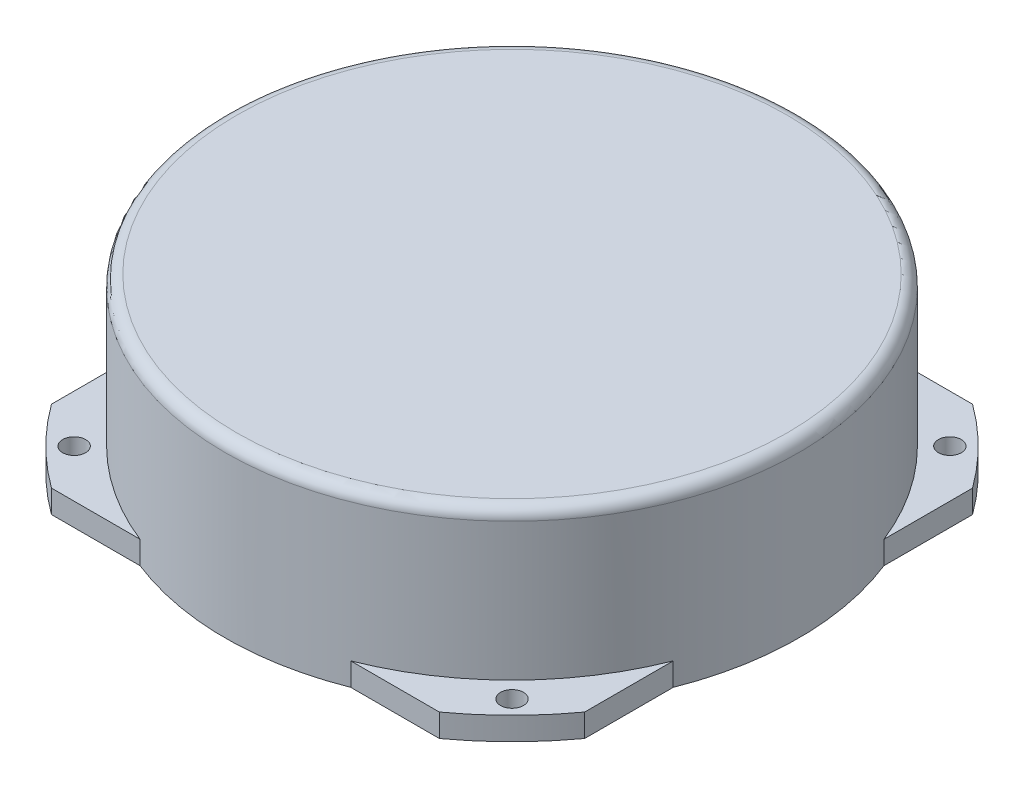
ISO-10303-21;
HEADER;
FILE_DESCRIPTION(('STEP AP214'),'2;1');
FILE_NAME('part.step','',(''),(''),'','','');
FILE_SCHEMA(('AUTOMOTIVE_DESIGN { 1 0 10303 214 1 1 1 1 }'));
ENDSEC;
DATA;
#1=APPLICATION_CONTEXT('core data for automotive mechanical design processes');
#2=APPLICATION_PROTOCOL_DEFINITION('international standard','automotive_design',2000,#1);
#3=PRODUCT_CONTEXT('',#1,'mechanical');
#4=PRODUCT('Part','Part','',(#3));
#5=PRODUCT_RELATED_PRODUCT_CATEGORY('part','',(#4));
#6=PRODUCT_DEFINITION_FORMATION('','',#4);
#7=PRODUCT_DEFINITION_CONTEXT('part definition',#1,'design');
#8=PRODUCT_DEFINITION('design','',#6,#7);
#9=PRODUCT_DEFINITION_SHAPE('','',#8);
#10=(LENGTH_UNIT() NAMED_UNIT(*) SI_UNIT(.MILLI.,.METRE.));
#11=(NAMED_UNIT(*) PLANE_ANGLE_UNIT() SI_UNIT($,.RADIAN.));
#12=(NAMED_UNIT(*) SI_UNIT($,.STERADIAN.) SOLID_ANGLE_UNIT());
#13=UNCERTAINTY_MEASURE_WITH_UNIT(LENGTH_MEASURE(1.E-05),#10,'distance_accuracy_value','');
#14=(GEOMETRIC_REPRESENTATION_CONTEXT(3) GLOBAL_UNCERTAINTY_ASSIGNED_CONTEXT((#13)) GLOBAL_UNIT_ASSIGNED_CONTEXT((#10,
#11,#12)) REPRESENTATION_CONTEXT('',''));
#15=CARTESIAN_POINT('',(0.,0.,0.));
#16=DIRECTION('',(0.,0.,1.));
#17=DIRECTION('',(1.,0.,0.));
#18=AXIS2_PLACEMENT_3D('',#15,#16,#17);
#19=CARTESIAN_POINT('',(0.,30.,0.));
#20=DIRECTION('',(0.,-1.,0.));
#21=DIRECTION('',(0.,0.,-1.));
#22=AXIS2_PLACEMENT_3D('',#19,#20,#21);
#23=CYLINDRICAL_SURFACE('',#22,50.);
#24=CARTESIAN_POINT('',(0.,28.,0.));
#25=DIRECTION('',(0.,1.,0.));
#26=DIRECTION('',(0.,0.,1.));
#27=AXIS2_PLACEMENT_3D('',#24,#25,#26);
#28=CIRCLE('',#27,50.);
#29=CARTESIAN_POINT('',(0.,28.,50.));
#30=VERTEX_POINT('',#29);
#31=EDGE_CURVE('E11',#30,#30,#28,.F.);
#32=ORIENTED_EDGE('',*,*,#31,.T.);
#33=EDGE_LOOP('',(#32));
#34=FACE_BOUND('',#33,.T.);
#35=CARTESIAN_POINT('',(0.,0.,0.));
#36=DIRECTION('',(0.,1.,0.));
#37=DIRECTION('',(0.,0.,1.));
#38=AXIS2_PLACEMENT_3D('',#35,#36,#37);
#39=CIRCLE('',#38,50.);
#40=CARTESIAN_POINT('',(46.5,0.,18.3779759494891));
#41=VERTEX_POINT('',#40);
#42=CARTESIAN_POINT('',(46.5,0.,-18.3779759494891));
#43=VERTEX_POINT('',#42);
#44=EDGE_CURVE('E399',#41,#43,#39,.T.);
#45=ORIENTED_EDGE('',*,*,#44,.T.);
#46=DIRECTION('',(0.,-1.,0.));
#47=VECTOR('',#46,1.);
#48=CARTESIAN_POINT('',(46.5,4.,-18.3779759494891));
#49=LINE('',#48,#47);
#50=CARTESIAN_POINT('',(46.5,4.,-18.3779759494891));
#51=VERTEX_POINT('',#50);
#52=EDGE_CURVE('E57',#51,#43,#49,.T.);
#53=ORIENTED_EDGE('',*,*,#52,.F.);
#54=CARTESIAN_POINT('',(0.,4.,0.));
#55=DIRECTION('',(0.,1.,0.));
#56=DIRECTION('',(0.,0.,1.));
#57=AXIS2_PLACEMENT_3D('',#54,#55,#56);
#58=CIRCLE('',#57,50.);
#59=CARTESIAN_POINT('',(18.3779759494892,4.,-46.5));
#60=VERTEX_POINT('',#59);
#61=EDGE_CURVE('E52',#51,#60,#58,.T.);
#62=ORIENTED_EDGE('',*,*,#61,.T.);
#63=DIRECTION('',(0.,-1.,0.));
#64=VECTOR('',#63,1.);
#65=CARTESIAN_POINT('',(18.3779759494891,4.,-46.5));
#66=LINE('',#65,#64);
#67=CARTESIAN_POINT('',(18.3779759494891,0.,-46.5));
#68=VERTEX_POINT('',#67);
#69=EDGE_CURVE('E188',#60,#68,#66,.T.);
#70=ORIENTED_EDGE('',*,*,#69,.T.);
#71=CARTESIAN_POINT('',(-18.3779759494892,0.,-46.5));
#72=VERTEX_POINT('',#71);
#73=EDGE_CURVE('E295',#68,#72,#39,.T.);
#74=ORIENTED_EDGE('',*,*,#73,.T.);
#75=DIRECTION('',(0.,-1.,0.));
#76=VECTOR('',#75,1.);
#77=CARTESIAN_POINT('',(-18.3779759494891,4.,-46.5));
#78=LINE('',#77,#76);
#79=CARTESIAN_POINT('',(-18.3779759494892,4.,-46.5));
#80=VERTEX_POINT('',#79);
#81=EDGE_CURVE('E275',#80,#72,#78,.T.);
#82=ORIENTED_EDGE('',*,*,#81,.F.);
#83=CARTESIAN_POINT('',(0.,4.,0.));
#84=DIRECTION('',(0.,1.,0.));
#85=DIRECTION('',(0.,0.,1.));
#86=AXIS2_PLACEMENT_3D('',#83,#84,#85);
#87=CIRCLE('',#86,50.);
#88=CARTESIAN_POINT('',(-46.5,4.,-18.3779759494891));
#89=VERTEX_POINT('',#88);
#90=EDGE_CURVE('E273',#80,#89,#87,.T.);
#91=ORIENTED_EDGE('',*,*,#90,.T.);
#92=DIRECTION('',(0.,-1.,0.));
#93=VECTOR('',#92,1.);
#94=CARTESIAN_POINT('',(-46.5,4.,-18.3779759494891));
#95=LINE('',#94,#93);
#96=CARTESIAN_POINT('',(-46.5,0.,-18.3779759494891));
#97=VERTEX_POINT('',#96);
#98=EDGE_CURVE('E288',#89,#97,#95,.T.);
#99=ORIENTED_EDGE('',*,*,#98,.T.);
#100=CARTESIAN_POINT('',(-46.5,0.,18.3779759494892));
#101=VERTEX_POINT('',#100);
#102=EDGE_CURVE('E296',#97,#101,#39,.T.);
#103=ORIENTED_EDGE('',*,*,#102,.T.);
#104=DIRECTION('',(0.,-1.,0.));
#105=VECTOR('',#104,1.);
#106=CARTESIAN_POINT('',(-46.5,4.,18.3779759494892));
#107=LINE('',#106,#105);
#108=CARTESIAN_POINT('',(-46.5,4.,18.3779759494892));
#109=VERTEX_POINT('',#108);
#110=EDGE_CURVE('E240',#109,#101,#107,.T.);
#111=ORIENTED_EDGE('',*,*,#110,.F.);
#112=CARTESIAN_POINT('',(0.,4.,0.));
#113=DIRECTION('',(0.,1.,0.));
#114=DIRECTION('',(0.,0.,1.));
#115=AXIS2_PLACEMENT_3D('',#112,#113,#114);
#116=CIRCLE('',#115,50.);
#117=CARTESIAN_POINT('',(-18.3779759494891,4.,46.5));
#118=VERTEX_POINT('',#117);
#119=EDGE_CURVE('E238',#109,#118,#116,.T.);
#120=ORIENTED_EDGE('',*,*,#119,.T.);
#121=DIRECTION('',(0.,-1.,0.));
#122=VECTOR('',#121,1.);
#123=CARTESIAN_POINT('',(-18.3779759494891,4.,46.5));
#124=LINE('',#123,#122);
#125=CARTESIAN_POINT('',(-18.3779759494891,0.,46.5));
#126=VERTEX_POINT('',#125);
#127=EDGE_CURVE('E253',#118,#126,#124,.T.);
#128=ORIENTED_EDGE('',*,*,#127,.T.);
#129=CARTESIAN_POINT('',(18.3779759494891,0.,46.5));
#130=VERTEX_POINT('',#129);
#131=EDGE_CURVE('E297',#126,#130,#39,.T.);
#132=ORIENTED_EDGE('',*,*,#131,.T.);
#133=DIRECTION('',(0.,-1.,0.));
#134=VECTOR('',#133,1.);
#135=CARTESIAN_POINT('',(18.3779759494891,4.,46.5));
#136=LINE('',#135,#134);
#137=CARTESIAN_POINT('',(18.3779759494891,4.,46.5));
#138=VERTEX_POINT('',#137);
#139=EDGE_CURVE('E205',#138,#130,#136,.T.);
#140=ORIENTED_EDGE('',*,*,#139,.F.);
#141=CARTESIAN_POINT('',(0.,4.,0.));
#142=DIRECTION('',(0.,1.,0.));
#143=DIRECTION('',(0.,0.,1.));
#144=AXIS2_PLACEMENT_3D('',#141,#142,#143);
#145=CIRCLE('',#144,50.);
#146=CARTESIAN_POINT('',(46.5,4.,18.3779759494891));
#147=VERTEX_POINT('',#146);
#148=EDGE_CURVE('E203',#138,#147,#145,.T.);
#149=ORIENTED_EDGE('',*,*,#148,.T.);
#150=DIRECTION('',(0.,-1.,0.));
#151=VECTOR('',#150,1.);
#152=CARTESIAN_POINT('',(46.5,4.,18.3779759494891));
#153=LINE('',#152,#151);
#154=EDGE_CURVE('E218',#147,#41,#153,.T.);
#155=ORIENTED_EDGE('',*,*,#154,.T.);
#156=EDGE_LOOP('',(#45,#53,#62,#70,#74,#82,#91,#99,#103,#111,#120,#128,#132,#140,#149,#155));
#157=FACE_BOUND('',#156,.T.);
#158=ADVANCED_FACE('F37',(#34,#157),#23,.T.);
#159=CARTESIAN_POINT('',(0.,30.,0.));
#160=DIRECTION('',(0.,1.,0.));
#161=DIRECTION('',(0.,0.,1.));
#162=AXIS2_PLACEMENT_3D('',#159,#160,#161);
#163=PLANE('',#162);
#164=CARTESIAN_POINT('',(0.,30.,0.));
#165=DIRECTION('',(0.,1.,0.));
#166=DIRECTION('',(0.,0.,1.));
#167=AXIS2_PLACEMENT_3D('',#164,#165,#166);
#168=CIRCLE('',#167,48.);
#169=CARTESIAN_POINT('',(0.,30.,48.));
#170=VERTEX_POINT('',#169);
#171=EDGE_CURVE('E45',#170,#170,#168,.T.);
#172=ORIENTED_EDGE('',*,*,#171,.T.);
#173=EDGE_LOOP('',(#172));
#174=FACE_BOUND('',#173,.T.);
#175=ADVANCED_FACE('F301',(#174),#163,.T.);
#176=CARTESIAN_POINT('',(0.,0.,0.));
#177=DIRECTION('',(0.,1.,0.));
#178=DIRECTION('',(0.,0.,1.));
#179=AXIS2_PLACEMENT_3D('',#176,#177,#178);
#180=PLANE('',#179);
#181=ORIENTED_EDGE('',*,*,#102,.F.);
#182=DIRECTION('',(0.,0.,-1.));
#183=VECTOR('',#182,1.);
#184=CARTESIAN_POINT('',(-46.5,0.,0.));
#185=LINE('',#184,#183);
#186=CARTESIAN_POINT('',(-46.5,0.,-33.8230690505755));
#187=VERTEX_POINT('',#186);
#188=EDGE_CURVE('E265',#97,#187,#185,.T.);
#189=ORIENTED_EDGE('',*,*,#188,.T.);
#190=CARTESIAN_POINT('',(0.,0.,0.));
#191=DIRECTION('',(0.,1.,0.));
#192=DIRECTION('',(0.,0.,1.));
#193=AXIS2_PLACEMENT_3D('',#190,#191,#192);
#194=CIRCLE('',#193,57.5);
#195=CARTESIAN_POINT('',(-33.8230690505755,0.,-46.5));
#196=VERTEX_POINT('',#195);
#197=EDGE_CURVE('E281',#196,#187,#194,.T.);
#198=ORIENTED_EDGE('',*,*,#197,.F.);
#199=DIRECTION('',(1.,0.,0.));
#200=VECTOR('',#199,1.);
#201=CARTESIAN_POINT('',(0.,0.,-46.5));
#202=LINE('',#201,#200);
#203=EDGE_CURVE('E278',#196,#72,#202,.T.);
#204=ORIENTED_EDGE('',*,*,#203,.T.);
#205=ORIENTED_EDGE('',*,*,#73,.F.);
#206=DIRECTION('',(1.,0.,0.));
#207=VECTOR('',#206,1.);
#208=CARTESIAN_POINT('',(0.,0.,-46.5));
#209=LINE('',#208,#207);
#210=CARTESIAN_POINT('',(33.8230690505755,0.,-46.5));
#211=VERTEX_POINT('',#210);
#212=EDGE_CURVE('E174',#68,#211,#209,.T.);
#213=ORIENTED_EDGE('',*,*,#212,.T.);
#214=CARTESIAN_POINT('',(0.,0.,0.));
#215=DIRECTION('',(0.,1.,0.));
#216=DIRECTION('',(0.,0.,1.));
#217=AXIS2_PLACEMENT_3D('',#214,#215,#216);
#218=CIRCLE('',#217,57.5);
#219=CARTESIAN_POINT('',(46.5,0.,-33.8230690505755));
#220=VERTEX_POINT('',#219);
#221=EDGE_CURVE('E183',#220,#211,#218,.T.);
#222=ORIENTED_EDGE('',*,*,#221,.F.);
#223=DIRECTION('',(0.,0.,1.));
#224=VECTOR('',#223,1.);
#225=CARTESIAN_POINT('',(46.5,0.,0.));
#226=LINE('',#225,#224);
#227=EDGE_CURVE('E155',#220,#43,#226,.T.);
#228=ORIENTED_EDGE('',*,*,#227,.T.);
#229=ORIENTED_EDGE('',*,*,#44,.F.);
#230=DIRECTION('',(0.,0.,1.));
#231=VECTOR('',#230,1.);
#232=CARTESIAN_POINT('',(46.5,0.,0.));
#233=LINE('',#232,#231);
#234=CARTESIAN_POINT('',(46.5,0.,33.8230690505755));
#235=VERTEX_POINT('',#234);
#236=EDGE_CURVE('E195',#41,#235,#233,.T.);
#237=ORIENTED_EDGE('',*,*,#236,.T.);
#238=CARTESIAN_POINT('',(0.,0.,0.));
#239=DIRECTION('',(0.,1.,0.));
#240=DIRECTION('',(0.,0.,1.));
#241=AXIS2_PLACEMENT_3D('',#238,#239,#240);
#242=CIRCLE('',#241,57.5);
#243=CARTESIAN_POINT('',(33.8230690505755,0.,46.5));
#244=VERTEX_POINT('',#243);
#245=EDGE_CURVE('E211',#244,#235,#242,.T.);
#246=ORIENTED_EDGE('',*,*,#245,.F.);
#247=DIRECTION('',(-1.,0.,0.));
#248=VECTOR('',#247,1.);
#249=CARTESIAN_POINT('',(0.,0.,46.5));
#250=LINE('',#249,#248);
#251=EDGE_CURVE('E208',#244,#130,#250,.T.);
#252=ORIENTED_EDGE('',*,*,#251,.T.);
#253=ORIENTED_EDGE('',*,*,#131,.F.);
#254=DIRECTION('',(-1.,0.,0.));
#255=VECTOR('',#254,1.);
#256=CARTESIAN_POINT('',(0.,0.,46.5));
#257=LINE('',#256,#255);
#258=CARTESIAN_POINT('',(-33.8230690505755,0.,46.5));
#259=VERTEX_POINT('',#258);
#260=EDGE_CURVE('E230',#126,#259,#257,.T.);
#261=ORIENTED_EDGE('',*,*,#260,.T.);
#262=CARTESIAN_POINT('',(0.,0.,0.));
#263=DIRECTION('',(0.,1.,0.));
#264=DIRECTION('',(0.,0.,1.));
#265=AXIS2_PLACEMENT_3D('',#262,#263,#264);
#266=CIRCLE('',#265,57.5);
#267=CARTESIAN_POINT('',(-46.5,0.,33.8230690505755));
#268=VERTEX_POINT('',#267);
#269=EDGE_CURVE('E246',#268,#259,#266,.T.);
#270=ORIENTED_EDGE('',*,*,#269,.F.);
#271=DIRECTION('',(0.,0.,-1.));
#272=VECTOR('',#271,1.);
#273=CARTESIAN_POINT('',(-46.5,0.,0.));
#274=LINE('',#273,#272);
#275=EDGE_CURVE('E243',#268,#101,#274,.T.);
#276=ORIENTED_EDGE('',*,*,#275,.T.);
#277=EDGE_LOOP('',(#181,#189,#198,#204,#205,#213,#222,#228,#229,#237,#246,#252,#253,#261,#270,#276));
#278=FACE_BOUND('',#277,.T.);
#279=CARTESIAN_POINT('',(-38.1837661840637,0.,-38.1837661840834));
#280=DIRECTION('',(0.,1.,0.));
#281=DIRECTION('',(0.,0.,1.));
#282=AXIS2_PLACEMENT_3D('',#279,#280,#281);
#283=CIRCLE('',#282,2.);
#284=CARTESIAN_POINT('',(-38.1837661840637,0.,-36.1837661840834));
#285=VERTEX_POINT('',#284);
#286=EDGE_CURVE('E260',#285,#285,#283,.T.);
#287=ORIENTED_EDGE('',*,*,#286,.T.);
#288=EDGE_LOOP('',(#287));
#289=FACE_BOUND('',#288,.T.);
#290=CARTESIAN_POINT('',(-38.1837661840791,0.,38.1837661840637));
#291=DIRECTION('',(0.,1.,0.));
#292=DIRECTION('',(0.,0.,1.));
#293=AXIS2_PLACEMENT_3D('',#290,#291,#292);
#294=CIRCLE('',#293,2.00000000000178);
#295=CARTESIAN_POINT('',(-38.1837661840791,0.,40.1837661840655));
#296=VERTEX_POINT('',#295);
#297=EDGE_CURVE('E225',#296,#296,#294,.T.);
#298=ORIENTED_EDGE('',*,*,#297,.T.);
#299=EDGE_LOOP('',(#298));
#300=FACE_BOUND('',#299,.T.);
#301=CARTESIAN_POINT('',(38.183766184068,0.,38.1837661840791));
#302=DIRECTION('',(0.,1.,0.));
#303=DIRECTION('',(0.,0.,1.));
#304=AXIS2_PLACEMENT_3D('',#301,#302,#303);
#305=CIRCLE('',#304,2.0000000000057);
#306=CARTESIAN_POINT('',(38.183766184068,0.,40.1837661840848));
#307=VERTEX_POINT('',#306);
#308=EDGE_CURVE('E159',#307,#307,#305,.T.);
#309=ORIENTED_EDGE('',*,*,#308,.T.);
#310=EDGE_LOOP('',(#309));
#311=FACE_BOUND('',#310,.T.);
#312=CARTESIAN_POINT('',(38.1837661840834,0.,-38.183766184068));
#313=DIRECTION('',(0.,1.,0.));
#314=DIRECTION('',(0.,0.,1.));
#315=AXIS2_PLACEMENT_3D('',#312,#313,#314);
#316=CIRCLE('',#315,2.00000000000427);
#317=CARTESIAN_POINT('',(38.1837661840834,0.,-36.1837661840637));
#318=VERTEX_POINT('',#317);
#319=EDGE_CURVE('E179',#318,#318,#316,.T.);
#320=ORIENTED_EDGE('',*,*,#319,.T.);
#321=EDGE_LOOP('',(#320));
#322=FACE_BOUND('',#321,.T.);
#323=ADVANCED_FACE('F317',(#278,#289,#300,#311,#322),#180,.F.);
#324=CARTESIAN_POINT('',(0.,4.,-46.5));
#325=DIRECTION('',(0.,0.,-1.));
#326=DIRECTION('',(-1.,0.,0.));
#327=AXIS2_PLACEMENT_3D('',#324,#325,#326);
#328=PLANE('',#327);
#329=ORIENTED_EDGE('',*,*,#203,.F.);
#330=DIRECTION('',(0.,-1.,0.));
#331=VECTOR('',#330,1.);
#332=CARTESIAN_POINT('',(-33.8230690505755,4.,-46.5));
#333=LINE('',#332,#331);
#334=CARTESIAN_POINT('',(-33.8230690505755,4.,-46.5));
#335=VERTEX_POINT('',#334);
#336=EDGE_CURVE('E293',#335,#196,#333,.T.);
#337=ORIENTED_EDGE('',*,*,#336,.F.);
#338=DIRECTION('',(1.,0.,0.));
#339=VECTOR('',#338,1.);
#340=CARTESIAN_POINT('',(0.,4.,-46.5));
#341=LINE('',#340,#339);
#342=EDGE_CURVE('E264',#335,#80,#341,.T.);
#343=ORIENTED_EDGE('',*,*,#342,.T.);
#344=ORIENTED_EDGE('',*,*,#81,.T.);
#345=EDGE_LOOP('',(#329,#337,#343,#344));
#346=FACE_BOUND('',#345,.T.);
#347=ADVANCED_FACE('F321',(#346),#328,.T.);
#348=CARTESIAN_POINT('',(0.,4.,0.));
#349=DIRECTION('',(0.,-1.,0.));
#350=DIRECTION('',(0.,0.,-1.));
#351=AXIS2_PLACEMENT_3D('',#348,#349,#350);
#352=CYLINDRICAL_SURFACE('',#351,57.5);
#353=ORIENTED_EDGE('',*,*,#197,.T.);
#354=DIRECTION('',(0.,-1.,0.));
#355=VECTOR('',#354,1.);
#356=CARTESIAN_POINT('',(-46.5,4.,-33.8230690505755));
#357=LINE('',#356,#355);
#358=CARTESIAN_POINT('',(-46.5,4.,-33.8230690505755));
#359=VERTEX_POINT('',#358);
#360=EDGE_CURVE('E291',#359,#187,#357,.T.);
#361=ORIENTED_EDGE('',*,*,#360,.F.);
#362=CARTESIAN_POINT('',(0.,4.,0.));
#363=DIRECTION('',(0.,1.,0.));
#364=DIRECTION('',(0.,0.,1.));
#365=AXIS2_PLACEMENT_3D('',#362,#363,#364);
#366=CIRCLE('',#365,57.5);
#367=EDGE_CURVE('E268',#335,#359,#366,.T.);
#368=ORIENTED_EDGE('',*,*,#367,.F.);
#369=ORIENTED_EDGE('',*,*,#336,.T.);
#370=EDGE_LOOP('',(#353,#361,#368,#369));
#371=FACE_BOUND('',#370,.T.);
#372=ADVANCED_FACE('F332',(#371),#352,.T.);
#373=CARTESIAN_POINT('',(-46.5,4.,0.));
#374=DIRECTION('',(-1.,0.,0.));
#375=DIRECTION('',(0.,0.,1.));
#376=AXIS2_PLACEMENT_3D('',#373,#374,#375);
#377=PLANE('',#376);
#378=ORIENTED_EDGE('',*,*,#188,.F.);
#379=ORIENTED_EDGE('',*,*,#98,.F.);
#380=DIRECTION('',(0.,0.,-1.));
#381=VECTOR('',#380,1.);
#382=CARTESIAN_POINT('',(-46.5,4.,0.));
#383=LINE('',#382,#381);
#384=EDGE_CURVE('E270',#89,#359,#383,.T.);
#385=ORIENTED_EDGE('',*,*,#384,.T.);
#386=ORIENTED_EDGE('',*,*,#360,.T.);
#387=EDGE_LOOP('',(#378,#379,#385,#386));
#388=FACE_BOUND('',#387,.T.);
#389=ADVANCED_FACE('F328',(#388),#377,.T.);
#390=CARTESIAN_POINT('',(-38.1837661840637,4.,-38.1837661840834));
#391=DIRECTION('',(0.,-1.,0.));
#392=DIRECTION('',(0.,0.,-1.));
#393=AXIS2_PLACEMENT_3D('',#390,#391,#392);
#394=CYLINDRICAL_SURFACE('',#393,2.);
#395=CARTESIAN_POINT('',(-38.1837661840637,4.,-38.1837661840834));
#396=DIRECTION('',(0.,1.,0.));
#397=DIRECTION('',(0.,0.,1.));
#398=AXIS2_PLACEMENT_3D('',#395,#396,#397);
#399=CIRCLE('',#398,2.);
#400=CARTESIAN_POINT('',(-38.1837661840637,4.,-36.1837661840834));
#401=VERTEX_POINT('',#400);
#402=EDGE_CURVE('E261',#401,#401,#399,.T.);
#403=ORIENTED_EDGE('',*,*,#402,.T.);
#404=EDGE_LOOP('',(#403));
#405=FACE_BOUND('',#404,.T.);
#406=ORIENTED_EDGE('',*,*,#286,.F.);
#407=EDGE_LOOP('',(#406));
#408=FACE_BOUND('',#407,.T.);
#409=ADVANCED_FACE('F324',(#405,#408),#394,.F.);
#410=CARTESIAN_POINT('',(0.,4.,0.));
#411=DIRECTION('',(0.,1.,0.));
#412=DIRECTION('',(0.,0.,1.));
#413=AXIS2_PLACEMENT_3D('',#410,#411,#412);
#414=PLANE('',#413);
#415=ORIENTED_EDGE('',*,*,#402,.F.);
#416=EDGE_LOOP('',(#415));
#417=FACE_BOUND('',#416,.T.);
#418=ORIENTED_EDGE('',*,*,#342,.F.);
#419=ORIENTED_EDGE('',*,*,#367,.T.);
#420=ORIENTED_EDGE('',*,*,#384,.F.);
#421=ORIENTED_EDGE('',*,*,#90,.F.);
#422=EDGE_LOOP('',(#418,#419,#420,#421));
#423=FACE_BOUND('',#422,.T.);
#424=ADVANCED_FACE('F327',(#417,#423),#414,.T.);
#425=CARTESIAN_POINT('',(-46.5,4.,0.));
#426=DIRECTION('',(-1.,0.,0.));
#427=DIRECTION('',(0.,0.,1.));
#428=AXIS2_PLACEMENT_3D('',#425,#426,#427);
#429=PLANE('',#428);
#430=ORIENTED_EDGE('',*,*,#275,.F.);
#431=DIRECTION('',(0.,-1.,0.));
#432=VECTOR('',#431,1.);
#433=CARTESIAN_POINT('',(-46.5,4.,33.8230690505755));
#434=LINE('',#433,#432);
#435=CARTESIAN_POINT('',(-46.5,4.,33.8230690505755));
#436=VERTEX_POINT('',#435);
#437=EDGE_CURVE('E258',#436,#268,#434,.T.);
#438=ORIENTED_EDGE('',*,*,#437,.F.);
#439=DIRECTION('',(0.,0.,-1.));
#440=VECTOR('',#439,1.);
#441=CARTESIAN_POINT('',(-46.5,4.,0.));
#442=LINE('',#441,#440);
#443=EDGE_CURVE('E229',#436,#109,#442,.T.);
#444=ORIENTED_EDGE('',*,*,#443,.T.);
#445=ORIENTED_EDGE('',*,*,#110,.T.);
#446=EDGE_LOOP('',(#430,#438,#444,#445));
#447=FACE_BOUND('',#446,.T.);
#448=ADVANCED_FACE('F342',(#447),#429,.T.);
#449=CARTESIAN_POINT('',(0.,4.,0.));
#450=DIRECTION('',(0.,-1.,0.));
#451=DIRECTION('',(0.,0.,-1.));
#452=AXIS2_PLACEMENT_3D('',#449,#450,#451);
#453=CYLINDRICAL_SURFACE('',#452,57.5);
#454=ORIENTED_EDGE('',*,*,#269,.T.);
#455=DIRECTION('',(0.,-1.,0.));
#456=VECTOR('',#455,1.);
#457=CARTESIAN_POINT('',(-33.8230690505755,4.,46.5));
#458=LINE('',#457,#456);
#459=CARTESIAN_POINT('',(-33.8230690505755,4.,46.5));
#460=VERTEX_POINT('',#459);
#461=EDGE_CURVE('E256',#460,#259,#458,.T.);
#462=ORIENTED_EDGE('',*,*,#461,.F.);
#463=CARTESIAN_POINT('',(0.,4.,0.));
#464=DIRECTION('',(0.,1.,0.));
#465=DIRECTION('',(0.,0.,1.));
#466=AXIS2_PLACEMENT_3D('',#463,#464,#465);
#467=CIRCLE('',#466,57.5);
#468=EDGE_CURVE('E233',#436,#460,#467,.T.);
#469=ORIENTED_EDGE('',*,*,#468,.F.);
#470=ORIENTED_EDGE('',*,*,#437,.T.);
#471=EDGE_LOOP('',(#454,#462,#469,#470));
#472=FACE_BOUND('',#471,.T.);
#473=ADVANCED_FACE('F352',(#472),#453,.T.);
#474=CARTESIAN_POINT('',(0.,4.,46.5));
#475=DIRECTION('',(0.,0.,1.));
#476=DIRECTION('',(1.,0.,0.));
#477=AXIS2_PLACEMENT_3D('',#474,#475,#476);
#478=PLANE('',#477);
#479=ORIENTED_EDGE('',*,*,#260,.F.);
#480=ORIENTED_EDGE('',*,*,#127,.F.);
#481=DIRECTION('',(-1.,0.,0.));
#482=VECTOR('',#481,1.);
#483=CARTESIAN_POINT('',(0.,4.,46.5));
#484=LINE('',#483,#482);
#485=EDGE_CURVE('E235',#118,#460,#484,.T.);
#486=ORIENTED_EDGE('',*,*,#485,.T.);
#487=ORIENTED_EDGE('',*,*,#461,.T.);
#488=EDGE_LOOP('',(#479,#480,#486,#487));
#489=FACE_BOUND('',#488,.T.);
#490=ADVANCED_FACE('F348',(#489),#478,.T.);
#491=CARTESIAN_POINT('',(-38.1837661840791,4.,38.1837661840637));
#492=DIRECTION('',(0.,-1.,0.));
#493=DIRECTION('',(0.,0.,-1.));
#494=AXIS2_PLACEMENT_3D('',#491,#492,#493);
#495=CYLINDRICAL_SURFACE('',#494,2.00000000000178);
#496=CARTESIAN_POINT('',(-38.1837661840791,4.,38.1837661840637));
#497=DIRECTION('',(0.,1.,0.));
#498=DIRECTION('',(0.,0.,1.));
#499=AXIS2_PLACEMENT_3D('',#496,#497,#498);
#500=CIRCLE('',#499,2.00000000000178);
#501=CARTESIAN_POINT('',(-38.1837661840791,4.,40.1837661840655));
#502=VERTEX_POINT('',#501);
#503=EDGE_CURVE('E226',#502,#502,#500,.T.);
#504=ORIENTED_EDGE('',*,*,#503,.T.);
#505=EDGE_LOOP('',(#504));
#506=FACE_BOUND('',#505,.T.);
#507=ORIENTED_EDGE('',*,*,#297,.F.);
#508=EDGE_LOOP('',(#507));
#509=FACE_BOUND('',#508,.T.);
#510=ADVANCED_FACE('F344',(#506,#509),#495,.F.);
#511=CARTESIAN_POINT('',(0.,4.,0.));
#512=DIRECTION('',(0.,1.,0.));
#513=DIRECTION('',(0.,0.,1.));
#514=AXIS2_PLACEMENT_3D('',#511,#512,#513);
#515=PLANE('',#514);
#516=ORIENTED_EDGE('',*,*,#503,.F.);
#517=EDGE_LOOP('',(#516));
#518=FACE_BOUND('',#517,.T.);
#519=ORIENTED_EDGE('',*,*,#443,.F.);
#520=ORIENTED_EDGE('',*,*,#468,.T.);
#521=ORIENTED_EDGE('',*,*,#485,.F.);
#522=ORIENTED_EDGE('',*,*,#119,.F.);
#523=EDGE_LOOP('',(#519,#520,#521,#522));
#524=FACE_BOUND('',#523,.T.);
#525=ADVANCED_FACE('F347',(#518,#524),#515,.T.);
#526=CARTESIAN_POINT('',(0.,4.,46.5));
#527=DIRECTION('',(0.,0.,1.));
#528=DIRECTION('',(1.,0.,0.));
#529=AXIS2_PLACEMENT_3D('',#526,#527,#528);
#530=PLANE('',#529);
#531=ORIENTED_EDGE('',*,*,#251,.F.);
#532=DIRECTION('',(0.,-1.,0.));
#533=VECTOR('',#532,1.);
#534=CARTESIAN_POINT('',(33.8230690505755,4.,46.5));
#535=LINE('',#534,#533);
#536=CARTESIAN_POINT('',(33.8230690505755,4.,46.5));
#537=VERTEX_POINT('',#536);
#538=EDGE_CURVE('E223',#537,#244,#535,.T.);
#539=ORIENTED_EDGE('',*,*,#538,.F.);
#540=DIRECTION('',(-1.,0.,0.));
#541=VECTOR('',#540,1.);
#542=CARTESIAN_POINT('',(0.,4.,46.5));
#543=LINE('',#542,#541);
#544=EDGE_CURVE('E194',#537,#138,#543,.T.);
#545=ORIENTED_EDGE('',*,*,#544,.T.);
#546=ORIENTED_EDGE('',*,*,#139,.T.);
#547=EDGE_LOOP('',(#531,#539,#545,#546));
#548=FACE_BOUND('',#547,.T.);
#549=ADVANCED_FACE('F362',(#548),#530,.T.);
#550=CARTESIAN_POINT('',(0.,4.,0.));
#551=DIRECTION('',(0.,-1.,0.));
#552=DIRECTION('',(0.,0.,-1.));
#553=AXIS2_PLACEMENT_3D('',#550,#551,#552);
#554=CYLINDRICAL_SURFACE('',#553,57.5);
#555=ORIENTED_EDGE('',*,*,#245,.T.);
#556=DIRECTION('',(0.,-1.,0.));
#557=VECTOR('',#556,1.);
#558=CARTESIAN_POINT('',(46.5,4.,33.8230690505755));
#559=LINE('',#558,#557);
#560=CARTESIAN_POINT('',(46.5,4.,33.8230690505755));
#561=VERTEX_POINT('',#560);
#562=EDGE_CURVE('E221',#561,#235,#559,.T.);
#563=ORIENTED_EDGE('',*,*,#562,.F.);
#564=CARTESIAN_POINT('',(0.,4.,0.));
#565=DIRECTION('',(0.,1.,0.));
#566=DIRECTION('',(0.,0.,1.));
#567=AXIS2_PLACEMENT_3D('',#564,#565,#566);
#568=CIRCLE('',#567,57.5);
#569=EDGE_CURVE('E198',#537,#561,#568,.T.);
#570=ORIENTED_EDGE('',*,*,#569,.F.);
#571=ORIENTED_EDGE('',*,*,#538,.T.);
#572=EDGE_LOOP('',(#555,#563,#570,#571));
#573=FACE_BOUND('',#572,.T.);
#574=ADVANCED_FACE('F372',(#573),#554,.T.);
#575=CARTESIAN_POINT('',(46.5,4.,0.));
#576=DIRECTION('',(1.,0.,0.));
#577=DIRECTION('',(0.,0.,-1.));
#578=AXIS2_PLACEMENT_3D('',#575,#576,#577);
#579=PLANE('',#578);
#580=ORIENTED_EDGE('',*,*,#236,.F.);
#581=ORIENTED_EDGE('',*,*,#154,.F.);
#582=DIRECTION('',(0.,0.,1.));
#583=VECTOR('',#582,1.);
#584=CARTESIAN_POINT('',(46.5,4.,0.));
#585=LINE('',#584,#583);
#586=EDGE_CURVE('E200',#147,#561,#585,.T.);
#587=ORIENTED_EDGE('',*,*,#586,.T.);
#588=ORIENTED_EDGE('',*,*,#562,.T.);
#589=EDGE_LOOP('',(#580,#581,#587,#588));
#590=FACE_BOUND('',#589,.T.);
#591=ADVANCED_FACE('F368',(#590),#579,.T.);
#592=CARTESIAN_POINT('',(38.183766184068,4.,38.1837661840791));
#593=DIRECTION('',(0.,-1.,0.));
#594=DIRECTION('',(0.,0.,-1.));
#595=AXIS2_PLACEMENT_3D('',#592,#593,#594);
#596=CYLINDRICAL_SURFACE('',#595,2.0000000000057);
#597=CARTESIAN_POINT('',(38.183766184068,4.,38.1837661840791));
#598=DIRECTION('',(0.,1.,0.));
#599=DIRECTION('',(0.,0.,1.));
#600=AXIS2_PLACEMENT_3D('',#597,#598,#599);
#601=CIRCLE('',#600,2.0000000000057);
#602=CARTESIAN_POINT('',(38.183766184068,4.,40.1837661840848));
#603=VERTEX_POINT('',#602);
#604=EDGE_CURVE('E191',#603,#603,#601,.T.);
#605=ORIENTED_EDGE('',*,*,#604,.T.);
#606=EDGE_LOOP('',(#605));
#607=FACE_BOUND('',#606,.T.);
#608=ORIENTED_EDGE('',*,*,#308,.F.);
#609=EDGE_LOOP('',(#608));
#610=FACE_BOUND('',#609,.T.);
#611=ADVANCED_FACE('F364',(#607,#610),#596,.F.);
#612=CARTESIAN_POINT('',(0.,4.,0.));
#613=DIRECTION('',(0.,1.,0.));
#614=DIRECTION('',(0.,0.,1.));
#615=AXIS2_PLACEMENT_3D('',#612,#613,#614);
#616=PLANE('',#615);
#617=ORIENTED_EDGE('',*,*,#604,.F.);
#618=EDGE_LOOP('',(#617));
#619=FACE_BOUND('',#618,.T.);
#620=ORIENTED_EDGE('',*,*,#544,.F.);
#621=ORIENTED_EDGE('',*,*,#569,.T.);
#622=ORIENTED_EDGE('',*,*,#586,.F.);
#623=ORIENTED_EDGE('',*,*,#148,.F.);
#624=EDGE_LOOP('',(#620,#621,#622,#623));
#625=FACE_BOUND('',#624,.T.);
#626=ADVANCED_FACE('F367',(#619,#625),#616,.T.);
#627=CARTESIAN_POINT('',(46.5,4.,0.));
#628=DIRECTION('',(1.,0.,0.));
#629=DIRECTION('',(0.,0.,-1.));
#630=AXIS2_PLACEMENT_3D('',#627,#628,#629);
#631=PLANE('',#630);
#632=ORIENTED_EDGE('',*,*,#227,.F.);
#633=DIRECTION('',(0.,-1.,0.));
#634=VECTOR('',#633,1.);
#635=CARTESIAN_POINT('',(46.5,4.,-33.8230690505755));
#636=LINE('',#635,#634);
#637=CARTESIAN_POINT('',(46.5,4.,-33.8230690505755));
#638=VERTEX_POINT('',#637);
#639=EDGE_CURVE('E149',#638,#220,#636,.T.);
#640=ORIENTED_EDGE('',*,*,#639,.F.);
#641=DIRECTION('',(0.,0.,1.));
#642=VECTOR('',#641,1.);
#643=CARTESIAN_POINT('',(46.5,4.,0.));
#644=LINE('',#643,#642);
#645=EDGE_CURVE('E153',#638,#51,#644,.T.);
#646=ORIENTED_EDGE('',*,*,#645,.T.);
#647=ORIENTED_EDGE('',*,*,#52,.T.);
#648=EDGE_LOOP('',(#632,#640,#646,#647));
#649=FACE_BOUND('',#648,.T.);
#650=ADVANCED_FACE('F151',(#649),#631,.T.);
#651=CARTESIAN_POINT('',(0.,4.,0.));
#652=DIRECTION('',(0.,-1.,0.));
#653=DIRECTION('',(0.,0.,-1.));
#654=AXIS2_PLACEMENT_3D('',#651,#652,#653);
#655=CYLINDRICAL_SURFACE('',#654,57.5);
#656=ORIENTED_EDGE('',*,*,#221,.T.);
#657=DIRECTION('',(0.,-1.,0.));
#658=VECTOR('',#657,1.);
#659=CARTESIAN_POINT('',(33.8230690505755,4.,-46.5));
#660=LINE('',#659,#658);
#661=CARTESIAN_POINT('',(33.8230690505755,4.,-46.5));
#662=VERTEX_POINT('',#661);
#663=EDGE_CURVE('E160',#662,#211,#660,.T.);
#664=ORIENTED_EDGE('',*,*,#663,.F.);
#665=CARTESIAN_POINT('',(0.,4.,0.));
#666=DIRECTION('',(0.,1.,0.));
#667=DIRECTION('',(0.,0.,1.));
#668=AXIS2_PLACEMENT_3D('',#665,#666,#667);
#669=CIRCLE('',#668,57.5);
#670=EDGE_CURVE('E163',#638,#662,#669,.T.);
#671=ORIENTED_EDGE('',*,*,#670,.F.);
#672=ORIENTED_EDGE('',*,*,#639,.T.);
#673=EDGE_LOOP('',(#656,#664,#671,#672));
#674=FACE_BOUND('',#673,.T.);
#675=ADVANCED_FACE('F164',(#674),#655,.T.);
#676=CARTESIAN_POINT('',(0.,4.,-46.5));
#677=DIRECTION('',(0.,0.,-1.));
#678=DIRECTION('',(-1.,0.,0.));
#679=AXIS2_PLACEMENT_3D('',#676,#677,#678);
#680=PLANE('',#679);
#681=ORIENTED_EDGE('',*,*,#212,.F.);
#682=ORIENTED_EDGE('',*,*,#69,.F.);
#683=DIRECTION('',(1.,0.,0.));
#684=VECTOR('',#683,1.);
#685=CARTESIAN_POINT('',(0.,4.,-46.5));
#686=LINE('',#685,#684);
#687=EDGE_CURVE('E168',#60,#662,#686,.T.);
#688=ORIENTED_EDGE('',*,*,#687,.T.);
#689=ORIENTED_EDGE('',*,*,#663,.T.);
#690=EDGE_LOOP('',(#681,#682,#688,#689));
#691=FACE_BOUND('',#690,.T.);
#692=ADVANCED_FACE('F385',(#691),#680,.T.);
#693=CARTESIAN_POINT('',(38.1837661840834,4.,-38.183766184068));
#694=DIRECTION('',(0.,-1.,0.));
#695=DIRECTION('',(0.,0.,-1.));
#696=AXIS2_PLACEMENT_3D('',#693,#694,#695);
#697=CYLINDRICAL_SURFACE('',#696,2.00000000000427);
#698=CARTESIAN_POINT('',(38.1837661840834,4.,-38.183766184068));
#699=DIRECTION('',(0.,1.,0.));
#700=DIRECTION('',(0.,0.,1.));
#701=AXIS2_PLACEMENT_3D('',#698,#699,#700);
#702=CIRCLE('',#701,2.00000000000427);
#703=CARTESIAN_POINT('',(38.1837661840834,4.,-36.1837661840637));
#704=VERTEX_POINT('',#703);
#705=EDGE_CURVE('E171',#704,#704,#702,.T.);
#706=ORIENTED_EDGE('',*,*,#705,.T.);
#707=EDGE_LOOP('',(#706));
#708=FACE_BOUND('',#707,.T.);
#709=ORIENTED_EDGE('',*,*,#319,.F.);
#710=EDGE_LOOP('',(#709));
#711=FACE_BOUND('',#710,.T.);
#712=ADVANCED_FACE('F308',(#708,#711),#697,.F.);
#713=CARTESIAN_POINT('',(0.,4.,0.));
#714=DIRECTION('',(0.,1.,0.));
#715=DIRECTION('',(0.,0.,1.));
#716=AXIS2_PLACEMENT_3D('',#713,#714,#715);
#717=PLANE('',#716);
#718=ORIENTED_EDGE('',*,*,#705,.F.);
#719=EDGE_LOOP('',(#718));
#720=FACE_BOUND('',#719,.T.);
#721=ORIENTED_EDGE('',*,*,#645,.F.);
#722=ORIENTED_EDGE('',*,*,#670,.T.);
#723=ORIENTED_EDGE('',*,*,#687,.F.);
#724=ORIENTED_EDGE('',*,*,#61,.F.);
#725=EDGE_LOOP('',(#721,#722,#723,#724));
#726=FACE_BOUND('',#725,.T.);
#727=ADVANCED_FACE('F170',(#720,#726),#717,.T.);
#728=CARTESIAN_POINT('',(0.,28.,0.));
#729=DIRECTION('',(0.,1.,0.));
#730=DIRECTION('',(0.,0.,1.));
#731=AXIS2_PLACEMENT_3D('',#728,#729,#730);
#732=TOROIDAL_SURFACE('',#731,48.,2.);
#733=ORIENTED_EDGE('',*,*,#31,.F.);
#734=EDGE_LOOP('',(#733));
#735=FACE_BOUND('',#734,.T.);
#736=ORIENTED_EDGE('',*,*,#171,.F.);
#737=EDGE_LOOP('',(#736));
#738=FACE_BOUND('',#737,.T.);
#739=ADVANCED_FACE('F39',(#735,#738),#732,.T.);
#740=CLOSED_SHELL('',(#158,#175,#323,#347,#372,#389,#409,#424,#448,#473,#490,#510,#525,#549,
#574,#591,#611,#626,#650,#675,#692,#712,#727,#739));
#741=MANIFOLD_SOLID_BREP('B2',#740);
#742=ADVANCED_BREP_SHAPE_REPRESENTATION('',(#18,#741),#14);
#743=SHAPE_DEFINITION_REPRESENTATION(#9,#742);
ENDSEC;
END-ISO-10303-21;
